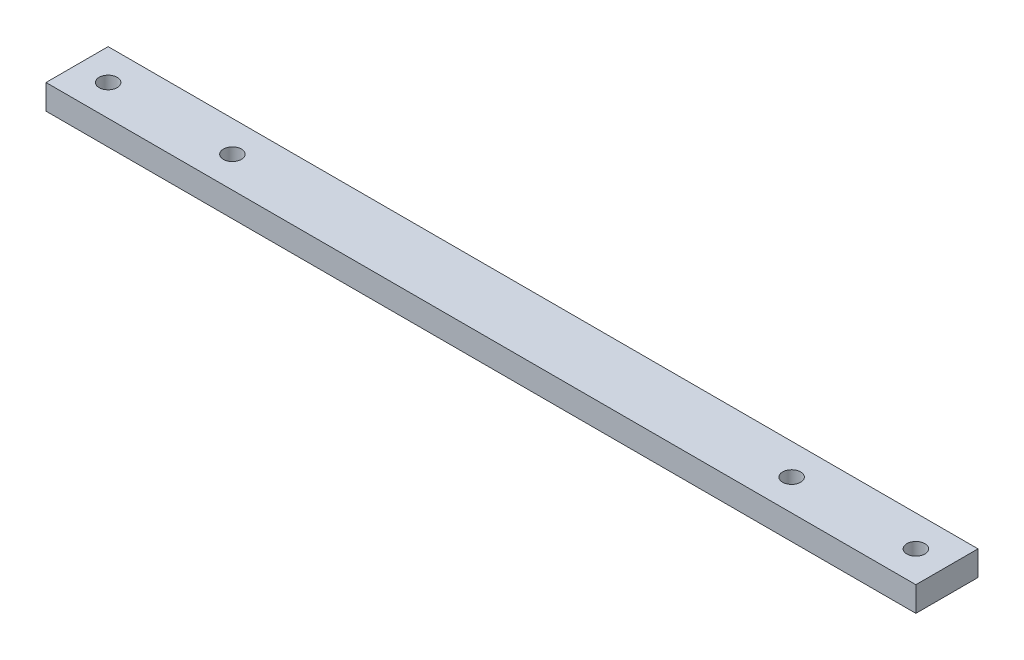
ISO-10303-21;
HEADER;
FILE_DESCRIPTION(('STEP AP214'),'2;1');
FILE_NAME('part.step','',(''),(''),'','','');
FILE_SCHEMA(('AUTOMOTIVE_DESIGN { 1 0 10303 214 1 1 1 1 }'));
ENDSEC;
DATA;
#1=APPLICATION_CONTEXT('core data for automotive mechanical design processes');
#2=APPLICATION_PROTOCOL_DEFINITION('international standard','automotive_design',2000,#1);
#3=PRODUCT_CONTEXT('',#1,'mechanical');
#4=PRODUCT('Part','Part','',(#3));
#5=PRODUCT_RELATED_PRODUCT_CATEGORY('part','',(#4));
#6=PRODUCT_DEFINITION_FORMATION('','',#4);
#7=PRODUCT_DEFINITION_CONTEXT('part definition',#1,'design');
#8=PRODUCT_DEFINITION('design','',#6,#7);
#9=PRODUCT_DEFINITION_SHAPE('','',#8);
#10=(LENGTH_UNIT() NAMED_UNIT(*) SI_UNIT(.MILLI.,.METRE.));
#11=(NAMED_UNIT(*) PLANE_ANGLE_UNIT() SI_UNIT($,.RADIAN.));
#12=(NAMED_UNIT(*) SI_UNIT($,.STERADIAN.) SOLID_ANGLE_UNIT());
#13=UNCERTAINTY_MEASURE_WITH_UNIT(LENGTH_MEASURE(1.E-05),#10,'distance_accuracy_value','');
#14=(GEOMETRIC_REPRESENTATION_CONTEXT(3) GLOBAL_UNCERTAINTY_ASSIGNED_CONTEXT((#13)) GLOBAL_UNIT_ASSIGNED_CONTEXT((#10,
#11,#12)) REPRESENTATION_CONTEXT('',''));
#15=CARTESIAN_POINT('',(0.,0.,0.));
#16=DIRECTION('',(0.,0.,1.));
#17=DIRECTION('',(1.,0.,0.));
#18=AXIS2_PLACEMENT_3D('',#15,#16,#17);
#19=CARTESIAN_POINT('',(70.,4.,-5.));
#20=DIRECTION('',(-1.,0.,0.));
#21=DIRECTION('',(0.,0.,1.));
#22=AXIS2_PLACEMENT_3D('',#19,#20,#21);
#23=PLANE('',#22);
#24=DIRECTION('',(0.,0.,-1.));
#25=VECTOR('',#24,1.);
#26=CARTESIAN_POINT('',(70.,0.,-5.));
#27=LINE('',#26,#25);
#28=CARTESIAN_POINT('',(70.,0.,5.));
#29=VERTEX_POINT('',#28);
#30=CARTESIAN_POINT('',(70.,0.,-5.));
#31=VERTEX_POINT('',#30);
#32=EDGE_CURVE('E96',#29,#31,#27,.T.);
#33=ORIENTED_EDGE('',*,*,#32,.T.);
#34=DIRECTION('',(0.,-1.,0.));
#35=VECTOR('',#34,1.);
#36=CARTESIAN_POINT('',(70.,4.,-5.));
#37=LINE('',#36,#35);
#38=CARTESIAN_POINT('',(70.,4.,-5.));
#39=VERTEX_POINT('',#38);
#40=EDGE_CURVE('E11',#39,#31,#37,.T.);
#41=ORIENTED_EDGE('',*,*,#40,.F.);
#42=DIRECTION('',(0.,0.,-1.));
#43=VECTOR('',#42,1.);
#44=CARTESIAN_POINT('',(70.,4.,-5.));
#45=LINE('',#44,#43);
#46=CARTESIAN_POINT('',(70.,4.,5.));
#47=VERTEX_POINT('',#46);
#48=EDGE_CURVE('E84',#47,#39,#45,.T.);
#49=ORIENTED_EDGE('',*,*,#48,.F.);
#50=DIRECTION('',(0.,-1.,0.));
#51=VECTOR('',#50,1.);
#52=CARTESIAN_POINT('',(70.,4.,5.));
#53=LINE('',#52,#51);
#54=EDGE_CURVE('E92',#47,#29,#53,.T.);
#55=ORIENTED_EDGE('',*,*,#54,.T.);
#56=EDGE_LOOP('',(#33,#41,#49,#55));
#57=FACE_BOUND('',#56,.T.);
#58=ADVANCED_FACE('F33',(#57),#23,.F.);
#59=CARTESIAN_POINT('',(-70.,4.,-5.));
#60=DIRECTION('',(0.,0.,1.));
#61=DIRECTION('',(1.,0.,0.));
#62=AXIS2_PLACEMENT_3D('',#59,#60,#61);
#63=PLANE('',#62);
#64=DIRECTION('',(-1.,0.,0.));
#65=VECTOR('',#64,1.);
#66=CARTESIAN_POINT('',(-70.,0.,-5.));
#67=LINE('',#66,#65);
#68=CARTESIAN_POINT('',(-70.,0.,-5.));
#69=VERTEX_POINT('',#68);
#70=EDGE_CURVE('E88',#31,#69,#67,.T.);
#71=ORIENTED_EDGE('',*,*,#70,.T.);
#72=DIRECTION('',(0.,-1.,0.));
#73=VECTOR('',#72,1.);
#74=CARTESIAN_POINT('',(-70.,4.,-5.));
#75=LINE('',#74,#73);
#76=CARTESIAN_POINT('',(-70.,4.,-5.));
#77=VERTEX_POINT('',#76);
#78=EDGE_CURVE('E41',#77,#69,#75,.T.);
#79=ORIENTED_EDGE('',*,*,#78,.F.);
#80=DIRECTION('',(-1.,0.,0.));
#81=VECTOR('',#80,1.);
#82=CARTESIAN_POINT('',(-70.,4.,-5.));
#83=LINE('',#82,#81);
#84=EDGE_CURVE('E79',#39,#77,#83,.T.);
#85=ORIENTED_EDGE('',*,*,#84,.F.);
#86=ORIENTED_EDGE('',*,*,#40,.T.);
#87=EDGE_LOOP('',(#71,#79,#85,#86));
#88=FACE_BOUND('',#87,.T.);
#89=ADVANCED_FACE('F87',(#88),#63,.F.);
#90=CARTESIAN_POINT('',(-70.,4.,-5.));
#91=DIRECTION('',(1.,0.,0.));
#92=DIRECTION('',(0.,0.,-1.));
#93=AXIS2_PLACEMENT_3D('',#90,#91,#92);
#94=PLANE('',#93);
#95=DIRECTION('',(0.,0.,1.));
#96=VECTOR('',#95,1.);
#97=CARTESIAN_POINT('',(-70.,0.,-5.));
#98=LINE('',#97,#96);
#99=CARTESIAN_POINT('',(-70.,0.,5.));
#100=VERTEX_POINT('',#99);
#101=EDGE_CURVE('E66',#69,#100,#98,.T.);
#102=ORIENTED_EDGE('',*,*,#101,.T.);
#103=DIRECTION('',(0.,-1.,0.));
#104=VECTOR('',#103,1.);
#105=CARTESIAN_POINT('',(-70.,4.,5.));
#106=LINE('',#105,#104);
#107=CARTESIAN_POINT('',(-70.,4.,5.));
#108=VERTEX_POINT('',#107);
#109=EDGE_CURVE('E89',#108,#100,#106,.T.);
#110=ORIENTED_EDGE('',*,*,#109,.F.);
#111=DIRECTION('',(0.,0.,1.));
#112=VECTOR('',#111,1.);
#113=CARTESIAN_POINT('',(-70.,4.,-5.));
#114=LINE('',#113,#112);
#115=EDGE_CURVE('E82',#77,#108,#114,.T.);
#116=ORIENTED_EDGE('',*,*,#115,.F.);
#117=ORIENTED_EDGE('',*,*,#78,.T.);
#118=EDGE_LOOP('',(#102,#110,#116,#117));
#119=FACE_BOUND('',#118,.T.);
#120=ADVANCED_FACE('F90',(#119),#94,.F.);
#121=CARTESIAN_POINT('',(-70.,4.,5.));
#122=DIRECTION('',(0.,0.,-1.));
#123=DIRECTION('',(-1.,0.,0.));
#124=AXIS2_PLACEMENT_3D('',#121,#122,#123);
#125=PLANE('',#124);
#126=DIRECTION('',(1.,0.,0.));
#127=VECTOR('',#126,1.);
#128=CARTESIAN_POINT('',(-70.,0.,5.));
#129=LINE('',#128,#127);
#130=EDGE_CURVE('E72',#100,#29,#129,.T.);
#131=ORIENTED_EDGE('',*,*,#130,.T.);
#132=ORIENTED_EDGE('',*,*,#54,.F.);
#133=DIRECTION('',(1.,0.,0.));
#134=VECTOR('',#133,1.);
#135=CARTESIAN_POINT('',(-70.,4.,5.));
#136=LINE('',#135,#134);
#137=EDGE_CURVE('E49',#108,#47,#136,.T.);
#138=ORIENTED_EDGE('',*,*,#137,.F.);
#139=ORIENTED_EDGE('',*,*,#109,.T.);
#140=EDGE_LOOP('',(#131,#132,#138,#139));
#141=FACE_BOUND('',#140,.T.);
#142=ADVANCED_FACE('F104',(#141),#125,.F.);
#143=CARTESIAN_POINT('',(0.,4.,0.));
#144=DIRECTION('',(0.,1.,0.));
#145=DIRECTION('',(0.,0.,1.));
#146=AXIS2_PLACEMENT_3D('',#143,#144,#145);
#147=PLANE('',#146);
#148=CARTESIAN_POINT('',(-65.,4.,0.));
#149=DIRECTION('',(0.,1.,0.));
#150=DIRECTION('',(0.,0.,1.));
#151=AXIS2_PLACEMENT_3D('',#148,#149,#150);
#152=CIRCLE('',#151,1.44999999999999);
#153=CARTESIAN_POINT('',(-65.,4.,1.44999999999999));
#154=VERTEX_POINT('',#153);
#155=EDGE_CURVE('E130',#154,#154,#152,.T.);
#156=ORIENTED_EDGE('',*,*,#155,.F.);
#157=EDGE_LOOP('',(#156));
#158=FACE_BOUND('',#157,.T.);
#159=CARTESIAN_POINT('',(65.,4.,0.));
#160=DIRECTION('',(0.,1.,0.));
#161=DIRECTION('',(0.,0.,1.));
#162=AXIS2_PLACEMENT_3D('',#159,#160,#161);
#163=CIRCLE('',#162,1.44999999999999);
#164=CARTESIAN_POINT('',(65.,4.,1.44999999999999));
#165=VERTEX_POINT('',#164);
#166=EDGE_CURVE('E124',#165,#165,#163,.T.);
#167=ORIENTED_EDGE('',*,*,#166,.F.);
#168=EDGE_LOOP('',(#167));
#169=FACE_BOUND('',#168,.T.);
#170=CARTESIAN_POINT('',(-45.,4.,0.));
#171=DIRECTION('',(0.,1.,0.));
#172=DIRECTION('',(0.,0.,1.));
#173=AXIS2_PLACEMENT_3D('',#170,#171,#172);
#174=CIRCLE('',#173,1.45);
#175=CARTESIAN_POINT('',(-45.,4.,1.45));
#176=VERTEX_POINT('',#175);
#177=EDGE_CURVE('E118',#176,#176,#174,.T.);
#178=ORIENTED_EDGE('',*,*,#177,.F.);
#179=EDGE_LOOP('',(#178));
#180=FACE_BOUND('',#179,.T.);
#181=CARTESIAN_POINT('',(45.,4.,0.));
#182=DIRECTION('',(0.,1.,0.));
#183=DIRECTION('',(0.,0.,1.));
#184=AXIS2_PLACEMENT_3D('',#181,#182,#183);
#185=CIRCLE('',#184,1.45);
#186=CARTESIAN_POINT('',(45.,4.,1.45));
#187=VERTEX_POINT('',#186);
#188=EDGE_CURVE('E112',#187,#187,#185,.T.);
#189=ORIENTED_EDGE('',*,*,#188,.F.);
#190=EDGE_LOOP('',(#189));
#191=FACE_BOUND('',#190,.T.);
#192=ORIENTED_EDGE('',*,*,#48,.T.);
#193=ORIENTED_EDGE('',*,*,#84,.T.);
#194=ORIENTED_EDGE('',*,*,#115,.T.);
#195=ORIENTED_EDGE('',*,*,#137,.T.);
#196=EDGE_LOOP('',(#192,#193,#194,#195));
#197=FACE_BOUND('',#196,.T.);
#198=ADVANCED_FACE('F80',(#158,#169,#180,#191,#197),#147,.T.);
#199=CARTESIAN_POINT('',(0.,0.,0.));
#200=DIRECTION('',(0.,1.,0.));
#201=DIRECTION('',(0.,0.,1.));
#202=AXIS2_PLACEMENT_3D('',#199,#200,#201);
#203=PLANE('',#202);
#204=CARTESIAN_POINT('',(-65.,0.,0.));
#205=DIRECTION('',(0.,1.,0.));
#206=DIRECTION('',(0.,0.,1.));
#207=AXIS2_PLACEMENT_3D('',#204,#205,#206);
#208=CIRCLE('',#207,1.44999999999999);
#209=CARTESIAN_POINT('',(-65.,0.,1.44999999999999));
#210=VERTEX_POINT('',#209);
#211=EDGE_CURVE('E127',#210,#210,#208,.T.);
#212=ORIENTED_EDGE('',*,*,#211,.T.);
#213=EDGE_LOOP('',(#212));
#214=FACE_BOUND('',#213,.T.);
#215=CARTESIAN_POINT('',(65.,0.,0.));
#216=DIRECTION('',(0.,1.,0.));
#217=DIRECTION('',(0.,0.,1.));
#218=AXIS2_PLACEMENT_3D('',#215,#216,#217);
#219=CIRCLE('',#218,1.44999999999999);
#220=CARTESIAN_POINT('',(65.,0.,1.44999999999999));
#221=VERTEX_POINT('',#220);
#222=EDGE_CURVE('E121',#221,#221,#219,.T.);
#223=ORIENTED_EDGE('',*,*,#222,.T.);
#224=EDGE_LOOP('',(#223));
#225=FACE_BOUND('',#224,.T.);
#226=CARTESIAN_POINT('',(-45.,0.,0.));
#227=DIRECTION('',(0.,1.,0.));
#228=DIRECTION('',(0.,0.,1.));
#229=AXIS2_PLACEMENT_3D('',#226,#227,#228);
#230=CIRCLE('',#229,1.45);
#231=CARTESIAN_POINT('',(-45.,0.,1.45));
#232=VERTEX_POINT('',#231);
#233=EDGE_CURVE('E115',#232,#232,#230,.T.);
#234=ORIENTED_EDGE('',*,*,#233,.T.);
#235=EDGE_LOOP('',(#234));
#236=FACE_BOUND('',#235,.T.);
#237=CARTESIAN_POINT('',(45.,0.,0.));
#238=DIRECTION('',(0.,1.,0.));
#239=DIRECTION('',(0.,0.,1.));
#240=AXIS2_PLACEMENT_3D('',#237,#238,#239);
#241=CIRCLE('',#240,1.45);
#242=CARTESIAN_POINT('',(45.,0.,1.45));
#243=VERTEX_POINT('',#242);
#244=EDGE_CURVE('E99',#243,#243,#241,.T.);
#245=ORIENTED_EDGE('',*,*,#244,.T.);
#246=EDGE_LOOP('',(#245));
#247=FACE_BOUND('',#246,.T.);
#248=ORIENTED_EDGE('',*,*,#32,.F.);
#249=ORIENTED_EDGE('',*,*,#130,.F.);
#250=ORIENTED_EDGE('',*,*,#101,.F.);
#251=ORIENTED_EDGE('',*,*,#70,.F.);
#252=EDGE_LOOP('',(#248,#249,#250,#251));
#253=FACE_BOUND('',#252,.T.);
#254=ADVANCED_FACE('F107',(#214,#225,#236,#247,#253),#203,.F.);
#255=CARTESIAN_POINT('',(45.,4.,0.));
#256=DIRECTION('',(0.,1.,0.));
#257=DIRECTION('',(0.,0.,1.));
#258=AXIS2_PLACEMENT_3D('',#255,#256,#257);
#259=CYLINDRICAL_SURFACE('',#258,1.45);
#260=ORIENTED_EDGE('',*,*,#244,.F.);
#261=EDGE_LOOP('',(#260));
#262=FACE_BOUND('',#261,.T.);
#263=ORIENTED_EDGE('',*,*,#188,.T.);
#264=EDGE_LOOP('',(#263));
#265=FACE_BOUND('',#264,.T.);
#266=ADVANCED_FACE('F145',(#262,#265),#259,.F.);
#267=CARTESIAN_POINT('',(-45.,4.,0.));
#268=DIRECTION('',(0.,1.,0.));
#269=DIRECTION('',(0.,0.,1.));
#270=AXIS2_PLACEMENT_3D('',#267,#268,#269);
#271=CYLINDRICAL_SURFACE('',#270,1.45);
#272=ORIENTED_EDGE('',*,*,#233,.F.);
#273=EDGE_LOOP('',(#272));
#274=FACE_BOUND('',#273,.T.);
#275=ORIENTED_EDGE('',*,*,#177,.T.);
#276=EDGE_LOOP('',(#275));
#277=FACE_BOUND('',#276,.T.);
#278=ADVANCED_FACE('F147',(#274,#277),#271,.F.);
#279=CARTESIAN_POINT('',(65.,4.,0.));
#280=DIRECTION('',(0.,1.,0.));
#281=DIRECTION('',(0.,0.,1.));
#282=AXIS2_PLACEMENT_3D('',#279,#280,#281);
#283=CYLINDRICAL_SURFACE('',#282,1.44999999999999);
#284=ORIENTED_EDGE('',*,*,#222,.F.);
#285=EDGE_LOOP('',(#284));
#286=FACE_BOUND('',#285,.T.);
#287=ORIENTED_EDGE('',*,*,#166,.T.);
#288=EDGE_LOOP('',(#287));
#289=FACE_BOUND('',#288,.T.);
#290=ADVANCED_FACE('F154',(#286,#289),#283,.F.);
#291=CARTESIAN_POINT('',(-65.,4.,0.));
#292=DIRECTION('',(0.,1.,0.));
#293=DIRECTION('',(0.,0.,1.));
#294=AXIS2_PLACEMENT_3D('',#291,#292,#293);
#295=CYLINDRICAL_SURFACE('',#294,1.44999999999999);
#296=ORIENTED_EDGE('',*,*,#211,.F.);
#297=EDGE_LOOP('',(#296));
#298=FACE_BOUND('',#297,.T.);
#299=ORIENTED_EDGE('',*,*,#155,.T.);
#300=EDGE_LOOP('',(#299));
#301=FACE_BOUND('',#300,.T.);
#302=ADVANCED_FACE('F134',(#298,#301),#295,.F.);
#303=CLOSED_SHELL('',(#58,#89,#120,#142,#198,#254,#266,#278,#290,#302));
#304=MANIFOLD_SOLID_BREP('B2',#303);
#305=ADVANCED_BREP_SHAPE_REPRESENTATION('',(#18,#304),#14);
#306=SHAPE_DEFINITION_REPRESENTATION(#9,#305);
ENDSEC;
END-ISO-10303-21;
